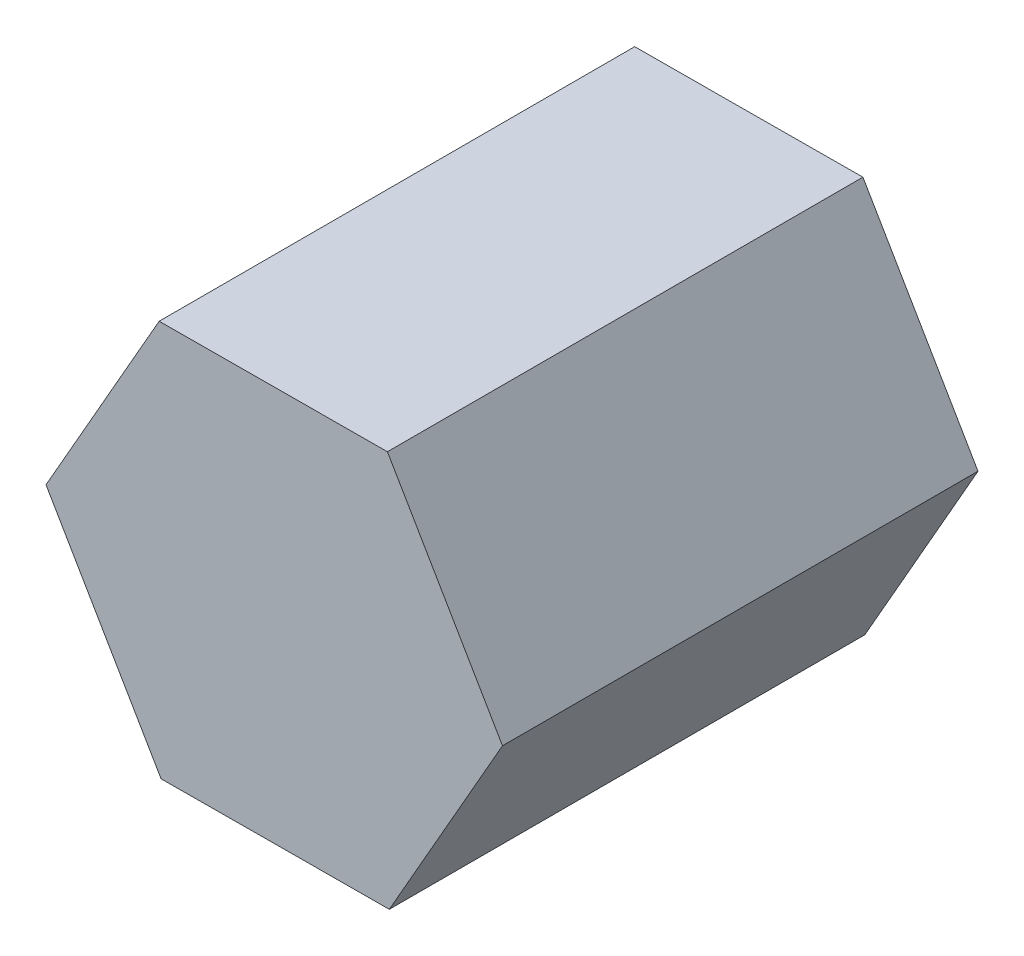
ISO-10303-21;
HEADER;
FILE_DESCRIPTION(('STEP AP214'),'2;1');
FILE_NAME('part.step','',(''),(''),'','','');
FILE_SCHEMA(('AUTOMOTIVE_DESIGN { 1 0 10303 214 1 1 1 1 }'));
ENDSEC;
DATA;
#1=APPLICATION_CONTEXT('core data for automotive mechanical design processes');
#2=APPLICATION_PROTOCOL_DEFINITION('international standard','automotive_design',2000,#1);
#3=PRODUCT_CONTEXT('',#1,'mechanical');
#4=PRODUCT('Part','Part','',(#3));
#5=PRODUCT_RELATED_PRODUCT_CATEGORY('part','',(#4));
#6=PRODUCT_DEFINITION_FORMATION('','',#4);
#7=PRODUCT_DEFINITION_CONTEXT('part definition',#1,'design');
#8=PRODUCT_DEFINITION('design','',#6,#7);
#9=PRODUCT_DEFINITION_SHAPE('','',#8);
#10=(LENGTH_UNIT() NAMED_UNIT(*) SI_UNIT(.MILLI.,.METRE.));
#11=(NAMED_UNIT(*) PLANE_ANGLE_UNIT() SI_UNIT($,.RADIAN.));
#12=(NAMED_UNIT(*) SI_UNIT($,.STERADIAN.) SOLID_ANGLE_UNIT());
#13=UNCERTAINTY_MEASURE_WITH_UNIT(LENGTH_MEASURE(1.E-05),#10,'distance_accuracy_value','');
#14=(GEOMETRIC_REPRESENTATION_CONTEXT(3) GLOBAL_UNCERTAINTY_ASSIGNED_CONTEXT((#13)) GLOBAL_UNIT_ASSIGNED_CONTEXT((#10,
#11,#12)) REPRESENTATION_CONTEXT('',''));
#15=CARTESIAN_POINT('',(0.,0.,0.));
#16=DIRECTION('',(0.,0.,1.));
#17=DIRECTION('',(1.,0.,0.));
#18=AXIS2_PLACEMENT_3D('',#15,#16,#17);
#19=CARTESIAN_POINT('',(-11.899334835292,-20.8427287507687,50.));
#20=DIRECTION('',(-0.00484319819177517,0.999988271646861,0.));
#21=DIRECTION('',(-0.999988271646861,-0.00484319819177517,0.));
#22=AXIS2_PLACEMENT_3D('',#19,#20,#21);
#23=PLANE('',#22);
#24=DIRECTION('',(0.99998827164686,0.00484319819177517,0.));
#25=VECTOR('',#24,1.);
#26=CARTESIAN_POINT('',(-11.899334835292,-20.8427287507687,0.));
#27=LINE('',#26,#25);
#28=CARTESIAN_POINT('',(-11.899334835292,-20.8427287507687,0.));
#29=VERTEX_POINT('',#28);
#30=CARTESIAN_POINT('',(12.100665164708,-20.7264906308844,0.));
#31=VERTEX_POINT('',#30);
#32=EDGE_CURVE('E117',#29,#31,#27,.T.);
#33=ORIENTED_EDGE('',*,*,#32,.T.);
#34=DIRECTION('',(0.,0.,-1.));
#35=VECTOR('',#34,1.);
#36=CARTESIAN_POINT('',(12.100665164708,-20.7264906308844,50.));
#37=LINE('',#36,#35);
#38=CARTESIAN_POINT('',(12.100665164708,-20.7264906308844,50.));
#39=VERTEX_POINT('',#38);
#40=EDGE_CURVE('E11',#39,#31,#37,.T.);
#41=ORIENTED_EDGE('',*,*,#40,.F.);
#42=DIRECTION('',(0.99998827164686,0.00484319819177517,0.));
#43=VECTOR('',#42,1.);
#44=CARTESIAN_POINT('',(-11.899334835292,-20.8427287507687,50.));
#45=LINE('',#44,#43);
#46=CARTESIAN_POINT('',(-11.899334835292,-20.8427287507687,50.));
#47=VERTEX_POINT('',#46);
#48=EDGE_CURVE('E128',#47,#39,#45,.T.);
#49=ORIENTED_EDGE('',*,*,#48,.F.);
#50=DIRECTION('',(0.,0.,-1.));
#51=VECTOR('',#50,1.);
#52=CARTESIAN_POINT('',(-11.899334835292,-20.8427287507687,50.));
#53=LINE('',#52,#51);
#54=EDGE_CURVE('E113',#47,#29,#53,.T.);
#55=ORIENTED_EDGE('',*,*,#54,.T.);
#56=EDGE_LOOP('',(#33,#41,#49,#55));
#57=FACE_BOUND('',#56,.T.);
#58=ADVANCED_FACE('F33',(#57),#23,.F.);
#59=CARTESIAN_POINT('',(12.100665164708,-20.7264906308844,50.));
#60=DIRECTION('',(-0.868436845828563,0.49579980315379,0.));
#61=DIRECTION('',(-0.49579980315379,-0.868436845828563,0.));
#62=AXIS2_PLACEMENT_3D('',#59,#60,#61);
#63=PLANE('',#62);
#64=DIRECTION('',(0.49579980315379,0.868436845828563,0.));
#65=VECTOR('',#64,1.);
#66=CARTESIAN_POINT('',(12.100665164708,-20.7264906308844,0.));
#67=LINE('',#66,#65);
#68=CARTESIAN_POINT('',(24.,0.116238119884325,0.));
#69=VERTEX_POINT('',#68);
#70=EDGE_CURVE('E120',#31,#69,#67,.T.);
#71=ORIENTED_EDGE('',*,*,#70,.T.);
#72=DIRECTION('',(0.,0.,-1.));
#73=VECTOR('',#72,1.);
#74=CARTESIAN_POINT('',(24.,0.116238119884325,50.));
#75=LINE('',#74,#73);
#76=CARTESIAN_POINT('',(24.,0.116238119884325,50.));
#77=VERTEX_POINT('',#76);
#78=EDGE_CURVE('E41',#77,#69,#75,.T.);
#79=ORIENTED_EDGE('',*,*,#78,.F.);
#80=DIRECTION('',(0.49579980315379,0.868436845828563,0.));
#81=VECTOR('',#80,1.);
#82=CARTESIAN_POINT('',(12.100665164708,-20.7264906308844,50.));
#83=LINE('',#82,#81);
#84=EDGE_CURVE('E86',#39,#77,#83,.T.);
#85=ORIENTED_EDGE('',*,*,#84,.F.);
#86=ORIENTED_EDGE('',*,*,#40,.T.);
#87=EDGE_LOOP('',(#71,#79,#85,#86));
#88=FACE_BOUND('',#87,.T.);
#89=ADVANCED_FACE('F152',(#88),#63,.F.);
#90=CARTESIAN_POINT('',(24.,0.116238119884325,50.));
#91=DIRECTION('',(-0.863593647636788,-0.50418846849307,0.));
#92=DIRECTION('',(0.50418846849307,-0.863593647636788,0.));
#93=AXIS2_PLACEMENT_3D('',#90,#91,#92);
#94=PLANE('',#93);
#95=DIRECTION('',(-0.50418846849307,0.863593647636788,0.));
#96=VECTOR('',#95,1.);
#97=CARTESIAN_POINT('',(24.,0.116238119884325,0.));
#98=LINE('',#97,#96);
#99=CARTESIAN_POINT('',(11.899334835292,20.8427287507687,0.));
#100=VERTEX_POINT('',#99);
#101=EDGE_CURVE('E123',#69,#100,#98,.T.);
#102=ORIENTED_EDGE('',*,*,#101,.T.);
#103=DIRECTION('',(0.,0.,-1.));
#104=VECTOR('',#103,1.);
#105=CARTESIAN_POINT('',(11.899334835292,20.8427287507687,50.));
#106=LINE('',#105,#104);
#107=CARTESIAN_POINT('',(11.899334835292,20.8427287507687,50.));
#108=VERTEX_POINT('',#107);
#109=EDGE_CURVE('E108',#108,#100,#106,.T.);
#110=ORIENTED_EDGE('',*,*,#109,.F.);
#111=DIRECTION('',(-0.50418846849307,0.863593647636788,0.));
#112=VECTOR('',#111,1.);
#113=CARTESIAN_POINT('',(24.,0.116238119884325,50.));
#114=LINE('',#113,#112);
#115=EDGE_CURVE('E99',#77,#108,#114,.T.);
#116=ORIENTED_EDGE('',*,*,#115,.F.);
#117=ORIENTED_EDGE('',*,*,#78,.T.);
#118=EDGE_LOOP('',(#102,#110,#116,#117));
#119=FACE_BOUND('',#118,.T.);
#120=ADVANCED_FACE('F134',(#119),#94,.F.);
#121=CARTESIAN_POINT('',(11.899334835292,20.8427287507687,50.));
#122=DIRECTION('',(0.00484319819177517,-0.999988271646861,0.));
#123=DIRECTION('',(0.999988271646861,0.00484319819177517,0.));
#124=AXIS2_PLACEMENT_3D('',#121,#122,#123);
#125=PLANE('',#124);
#126=DIRECTION('',(-0.99998827164686,-0.00484319819177517,0.));
#127=VECTOR('',#126,1.);
#128=CARTESIAN_POINT('',(11.899334835292,20.8427287507687,0.));
#129=LINE('',#128,#127);
#130=CARTESIAN_POINT('',(-12.100665164708,20.7264906308844,0.));
#131=VERTEX_POINT('',#130);
#132=EDGE_CURVE('E107',#100,#131,#129,.T.);
#133=ORIENTED_EDGE('',*,*,#132,.T.);
#134=DIRECTION('',(0.,0.,-1.));
#135=VECTOR('',#134,1.);
#136=CARTESIAN_POINT('',(-12.100665164708,20.7264906308844,50.));
#137=LINE('',#136,#135);
#138=CARTESIAN_POINT('',(-12.100665164708,20.7264906308844,50.));
#139=VERTEX_POINT('',#138);
#140=EDGE_CURVE('E104',#139,#131,#137,.T.);
#141=ORIENTED_EDGE('',*,*,#140,.F.);
#142=DIRECTION('',(-0.99998827164686,-0.00484319819177517,0.));
#143=VECTOR('',#142,1.);
#144=CARTESIAN_POINT('',(11.899334835292,20.8427287507687,50.));
#145=LINE('',#144,#143);
#146=EDGE_CURVE('E93',#108,#139,#145,.T.);
#147=ORIENTED_EDGE('',*,*,#146,.F.);
#148=ORIENTED_EDGE('',*,*,#109,.T.);
#149=EDGE_LOOP('',(#133,#141,#147,#148));
#150=FACE_BOUND('',#149,.T.);
#151=ADVANCED_FACE('F105',(#150),#125,.F.);
#152=CARTESIAN_POINT('',(-12.100665164708,20.7264906308844,50.));
#153=DIRECTION('',(0.868436845828563,-0.49579980315379,0.));
#154=DIRECTION('',(0.49579980315379,0.868436845828563,0.));
#155=AXIS2_PLACEMENT_3D('',#152,#153,#154);
#156=PLANE('',#155);
#157=DIRECTION('',(-0.49579980315379,-0.868436845828563,0.));
#158=VECTOR('',#157,1.);
#159=CARTESIAN_POINT('',(-12.100665164708,20.7264906308844,0.));
#160=LINE('',#159,#158);
#161=CARTESIAN_POINT('',(-24.,-0.116238119884319,0.));
#162=VERTEX_POINT('',#161);
#163=EDGE_CURVE('E72',#131,#162,#160,.T.);
#164=ORIENTED_EDGE('',*,*,#163,.T.);
#165=DIRECTION('',(0.,0.,-1.));
#166=VECTOR('',#165,1.);
#167=CARTESIAN_POINT('',(-24.,-0.116238119884319,50.));
#168=LINE('',#167,#166);
#169=CARTESIAN_POINT('',(-24.,-0.116238119884319,50.));
#170=VERTEX_POINT('',#169);
#171=EDGE_CURVE('E109',#170,#162,#168,.T.);
#172=ORIENTED_EDGE('',*,*,#171,.F.);
#173=DIRECTION('',(-0.49579980315379,-0.868436845828563,0.));
#174=VECTOR('',#173,1.);
#175=CARTESIAN_POINT('',(-12.100665164708,20.7264906308844,50.));
#176=LINE('',#175,#174);
#177=EDGE_CURVE('E97',#139,#170,#176,.T.);
#178=ORIENTED_EDGE('',*,*,#177,.F.);
#179=ORIENTED_EDGE('',*,*,#140,.T.);
#180=EDGE_LOOP('',(#164,#172,#178,#179));
#181=FACE_BOUND('',#180,.T.);
#182=ADVANCED_FACE('F111',(#181),#156,.F.);
#183=CARTESIAN_POINT('',(-24.,-0.116238119884319,50.));
#184=DIRECTION('',(0.863593647636788,0.50418846849307,0.));
#185=DIRECTION('',(-0.50418846849307,0.863593647636788,0.));
#186=AXIS2_PLACEMENT_3D('',#183,#184,#185);
#187=PLANE('',#186);
#188=DIRECTION('',(0.50418846849307,-0.863593647636788,0.));
#189=VECTOR('',#188,1.);
#190=CARTESIAN_POINT('',(-24.,-0.116238119884319,0.));
#191=LINE('',#190,#189);
#192=EDGE_CURVE('E78',#162,#29,#191,.T.);
#193=ORIENTED_EDGE('',*,*,#192,.T.);
#194=ORIENTED_EDGE('',*,*,#54,.F.);
#195=DIRECTION('',(0.50418846849307,-0.863593647636788,0.));
#196=VECTOR('',#195,1.);
#197=CARTESIAN_POINT('',(-24.,-0.116238119884319,50.));
#198=LINE('',#197,#196);
#199=EDGE_CURVE('E49',#170,#47,#198,.T.);
#200=ORIENTED_EDGE('',*,*,#199,.F.);
#201=ORIENTED_EDGE('',*,*,#171,.T.);
#202=EDGE_LOOP('',(#193,#194,#200,#201));
#203=FACE_BOUND('',#202,.T.);
#204=ADVANCED_FACE('F141',(#203),#187,.F.);
#205=CARTESIAN_POINT('',(0.,0.,50.));
#206=DIRECTION('',(0.,0.,1.));
#207=DIRECTION('',(1.,0.,0.));
#208=AXIS2_PLACEMENT_3D('',#205,#206,#207);
#209=PLANE('',#208);
#210=ORIENTED_EDGE('',*,*,#48,.T.);
#211=ORIENTED_EDGE('',*,*,#84,.T.);
#212=ORIENTED_EDGE('',*,*,#115,.T.);
#213=ORIENTED_EDGE('',*,*,#146,.T.);
#214=ORIENTED_EDGE('',*,*,#177,.T.);
#215=ORIENTED_EDGE('',*,*,#199,.T.);
#216=EDGE_LOOP('',(#210,#211,#212,#213,#214,#215));
#217=FACE_BOUND('',#216,.T.);
#218=ADVANCED_FACE('F95',(#217),#209,.T.);
#219=CARTESIAN_POINT('',(0.,0.,0.));
#220=DIRECTION('',(0.,0.,1.));
#221=DIRECTION('',(1.,0.,0.));
#222=AXIS2_PLACEMENT_3D('',#219,#220,#221);
#223=PLANE('',#222);
#224=CARTESIAN_POINT('',(0.,0.,0.));
#225=DIRECTION('',(0.,0.,-1.));
#226=DIRECTION('',(-1.,0.,0.));
#227=AXIS2_PLACEMENT_3D('',#224,#225,#226);
#228=CIRCLE('',#227,5.);
#229=CARTESIAN_POINT('',(-5.,0.,0.));
#230=VERTEX_POINT('',#229);
#231=EDGE_CURVE('E214',#230,#230,#228,.T.);
#232=ORIENTED_EDGE('',*,*,#231,.F.);
#233=EDGE_LOOP('',(#232));
#234=FACE_BOUND('',#233,.T.);
#235=ORIENTED_EDGE('',*,*,#32,.F.);
#236=ORIENTED_EDGE('',*,*,#192,.F.);
#237=ORIENTED_EDGE('',*,*,#163,.F.);
#238=ORIENTED_EDGE('',*,*,#132,.F.);
#239=ORIENTED_EDGE('',*,*,#101,.F.);
#240=ORIENTED_EDGE('',*,*,#70,.F.);
#241=EDGE_LOOP('',(#235,#236,#237,#238,#239,#240));
#242=FACE_BOUND('',#241,.T.);
#243=ADVANCED_FACE('F137',(#234,#242),#223,.F.);
#244=CARTESIAN_POINT('',(0.,0.,10.));
#245=DIRECTION('',(0.,0.,-1.));
#246=DIRECTION('',(-1.,0.,0.));
#247=AXIS2_PLACEMENT_3D('',#244,#245,#246);
#248=CYLINDRICAL_SURFACE('',#247,5.);
#249=CARTESIAN_POINT('',(0.,0.,10.));
#250=DIRECTION('',(0.,0.,-1.));
#251=DIRECTION('',(-1.,0.,0.));
#252=AXIS2_PLACEMENT_3D('',#249,#250,#251);
#253=CIRCLE('',#252,5.);
#254=CARTESIAN_POINT('',(-5.,0.,10.));
#255=VERTEX_POINT('',#254);
#256=EDGE_CURVE('E121',#255,#255,#253,.T.);
#257=ORIENTED_EDGE('',*,*,#256,.F.);
#258=EDGE_LOOP('',(#257));
#259=FACE_BOUND('',#258,.T.);
#260=ORIENTED_EDGE('',*,*,#231,.T.);
#261=EDGE_LOOP('',(#260));
#262=FACE_BOUND('',#261,.T.);
#263=ADVANCED_FACE('F189',(#259,#262),#248,.F.);
#264=CARTESIAN_POINT('',(0.,0.,10.));
#265=DIRECTION('',(0.,0.,-1.));
#266=DIRECTION('',(-1.,0.,0.));
#267=AXIS2_PLACEMENT_3D('',#264,#265,#266);
#268=PLANE('',#267);
#269=ORIENTED_EDGE('',*,*,#256,.T.);
#270=EDGE_LOOP('',(#269));
#271=FACE_BOUND('',#270,.T.);
#272=ADVANCED_FACE('F198',(#271),#268,.T.);
#273=CLOSED_SHELL('',(#58,#89,#120,#151,#182,#204,#218,#243,#263,#272));
#274=MANIFOLD_SOLID_BREP('B2',#273);
#275=ADVANCED_BREP_SHAPE_REPRESENTATION('',(#18,#274),#14);
#276=SHAPE_DEFINITION_REPRESENTATION(#9,#275);
ENDSEC;
END-ISO-10303-21;
